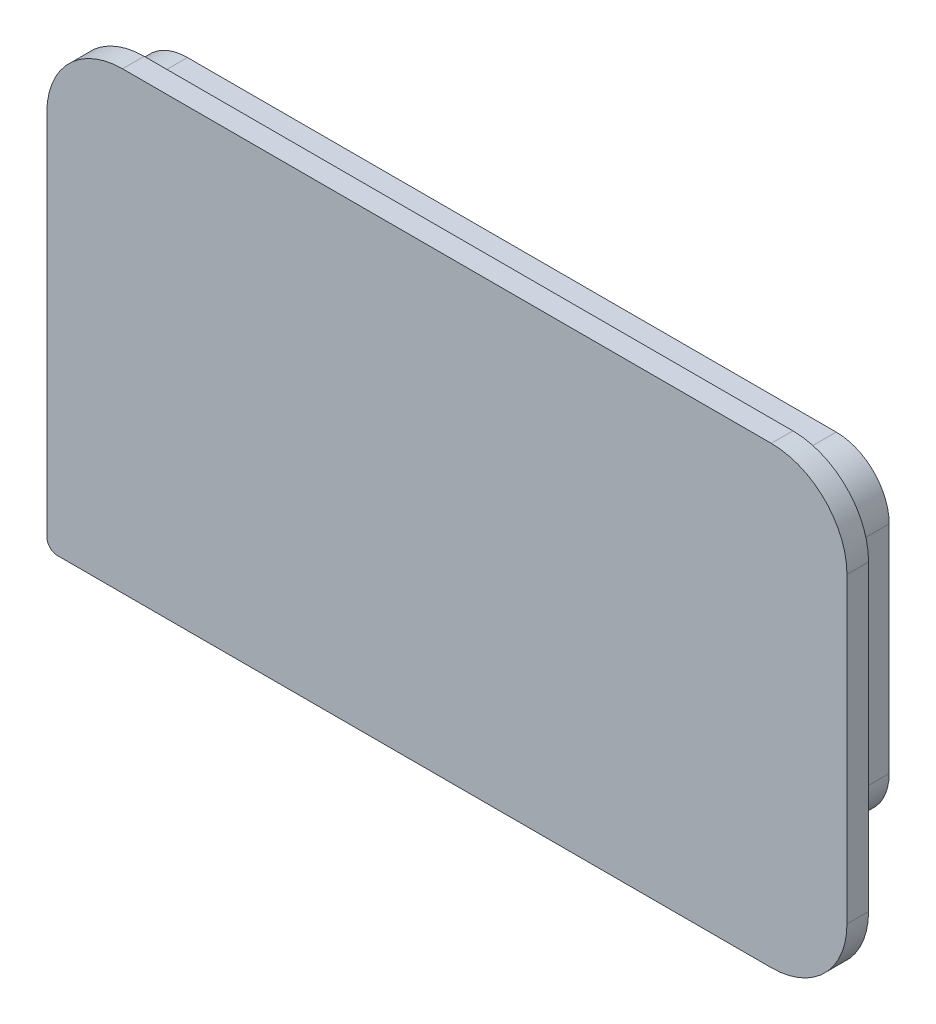
ISO-10303-21;
HEADER;
FILE_DESCRIPTION(('STEP AP214'),'2;1');
FILE_NAME('part.step','',(''),(''),'','','');
FILE_SCHEMA(('AUTOMOTIVE_DESIGN { 1 0 10303 214 1 1 1 1 }'));
ENDSEC;
DATA;
#1=APPLICATION_CONTEXT('core data for automotive mechanical design processes');
#2=APPLICATION_PROTOCOL_DEFINITION('international standard','automotive_design',2000,#1);
#3=PRODUCT_CONTEXT('',#1,'mechanical');
#4=PRODUCT('Part','Part','',(#3));
#5=PRODUCT_RELATED_PRODUCT_CATEGORY('part','',(#4));
#6=PRODUCT_DEFINITION_FORMATION('','',#4);
#7=PRODUCT_DEFINITION_CONTEXT('part definition',#1,'design');
#8=PRODUCT_DEFINITION('design','',#6,#7);
#9=PRODUCT_DEFINITION_SHAPE('','',#8);
#10=(LENGTH_UNIT() NAMED_UNIT(*) SI_UNIT(.MILLI.,.METRE.));
#11=(NAMED_UNIT(*) PLANE_ANGLE_UNIT() SI_UNIT($,.RADIAN.));
#12=(NAMED_UNIT(*) SI_UNIT($,.STERADIAN.) SOLID_ANGLE_UNIT());
#13=UNCERTAINTY_MEASURE_WITH_UNIT(LENGTH_MEASURE(1.E-05),#10,'distance_accuracy_value','');
#14=(GEOMETRIC_REPRESENTATION_CONTEXT(3) GLOBAL_UNCERTAINTY_ASSIGNED_CONTEXT((#13)) GLOBAL_UNIT_ASSIGNED_CONTEXT((#10,
#11,#12)) REPRESENTATION_CONTEXT('',''));
#15=CARTESIAN_POINT('',(0.,0.,0.));
#16=DIRECTION('',(0.,0.,1.));
#17=DIRECTION('',(1.,0.,0.));
#18=AXIS2_PLACEMENT_3D('',#15,#16,#17);
#19=CARTESIAN_POINT('',(-37.,-21.,2.));
#20=DIRECTION('',(1.,0.,0.));
#21=DIRECTION('',(0.,0.,-1.));
#22=AXIS2_PLACEMENT_3D('',#19,#20,#21);
#23=PLANE('',#22);
#24=DIRECTION('',(0.,1.,0.));
#25=VECTOR('',#24,1.);
#26=CARTESIAN_POINT('',(-37.,-21.,0.));
#27=LINE('',#26,#25);
#28=CARTESIAN_POINT('',(-37.,-20.,0.));
#29=VERTEX_POINT('',#28);
#30=CARTESIAN_POINT('',(-37.,14.,0.));
#31=VERTEX_POINT('',#30);
#32=EDGE_CURVE('E277',#29,#31,#27,.T.);
#33=ORIENTED_EDGE('',*,*,#32,.F.);
#34=DIRECTION('',(0.,0.,-1.));
#35=VECTOR('',#34,1.);
#36=CARTESIAN_POINT('',(-37.,-20.,2.));
#37=LINE('',#36,#35);
#38=CARTESIAN_POINT('',(-37.,-20.,2.));
#39=VERTEX_POINT('',#38);
#40=EDGE_CURVE('E43',#29,#39,#37,.F.);
#41=ORIENTED_EDGE('',*,*,#40,.T.);
#42=DIRECTION('',(0.,-1.,0.));
#43=VECTOR('',#42,1.);
#44=CARTESIAN_POINT('',(-37.,-21.,2.));
#45=LINE('',#44,#43);
#46=CARTESIAN_POINT('',(-37.,14.,2.));
#47=VERTEX_POINT('',#46);
#48=EDGE_CURVE('E313',#47,#39,#45,.T.);
#49=ORIENTED_EDGE('',*,*,#48,.F.);
#50=DIRECTION('',(0.,0.,-1.));
#51=VECTOR('',#50,1.);
#52=CARTESIAN_POINT('',(-37.,14.,2.));
#53=LINE('',#52,#51);
#54=EDGE_CURVE('E383',#47,#31,#53,.T.);
#55=ORIENTED_EDGE('',*,*,#54,.T.);
#56=EDGE_LOOP('',(#33,#41,#49,#55));
#57=FACE_BOUND('',#56,.T.);
#58=ADVANCED_FACE('F35',(#57),#23,.F.);
#59=CARTESIAN_POINT('',(37.,-21.,2.));
#60=DIRECTION('',(0.,1.,0.));
#61=DIRECTION('',(-1.,0.,0.));
#62=AXIS2_PLACEMENT_3D('',#59,#60,#61);
#63=PLANE('',#62);
#64=DIRECTION('',(1.,0.,0.));
#65=VECTOR('',#64,1.);
#66=CARTESIAN_POINT('',(37.,-21.,2.));
#67=LINE('',#66,#65);
#68=CARTESIAN_POINT('',(-36.,-21.,2.));
#69=VERTEX_POINT('',#68);
#70=CARTESIAN_POINT('',(30.,-21.,2.));
#71=VERTEX_POINT('',#70);
#72=EDGE_CURVE('E315',#69,#71,#67,.T.);
#73=ORIENTED_EDGE('',*,*,#72,.F.);
#74=DIRECTION('',(0.,0.,-1.));
#75=VECTOR('',#74,1.);
#76=CARTESIAN_POINT('',(-36.,-21.,2.));
#77=LINE('',#76,#75);
#78=CARTESIAN_POINT('',(-36.,-21.,0.));
#79=VERTEX_POINT('',#78);
#80=EDGE_CURVE('E446',#69,#79,#77,.T.);
#81=ORIENTED_EDGE('',*,*,#80,.T.);
#82=DIRECTION('',(-1.,0.,0.));
#83=VECTOR('',#82,1.);
#84=CARTESIAN_POINT('',(37.,-21.,0.));
#85=LINE('',#84,#83);
#86=CARTESIAN_POINT('',(-35.5417424305044,-21.,0.));
#87=VERTEX_POINT('',#86);
#88=EDGE_CURVE('E284',#87,#79,#85,.T.);
#89=ORIENTED_EDGE('',*,*,#88,.F.);
#90=DIRECTION('',(0.,0.,1.));
#91=VECTOR('',#90,1.);
#92=CARTESIAN_POINT('',(-35.5417424305044,-21.,-90.3608809701494));
#93=LINE('',#92,#91);
#94=CARTESIAN_POINT('',(-35.5417424305044,-21.,-5.));
#95=VERTEX_POINT('',#94);
#96=EDGE_CURVE('E227',#95,#87,#93,.T.);
#97=ORIENTED_EDGE('',*,*,#96,.F.);
#98=DIRECTION('',(-1.,0.,0.));
#99=VECTOR('',#98,1.);
#100=CARTESIAN_POINT('',(-35.,-21.,-5.));
#101=LINE('',#100,#99);
#102=CARTESIAN_POINT('',(-35.,-21.,-5.));
#103=VERTEX_POINT('',#102);
#104=EDGE_CURVE('E309',#103,#95,#101,.T.);
#105=ORIENTED_EDGE('',*,*,#104,.F.);
#106=CARTESIAN_POINT('',(-30.,-21.,-5.));
#107=DIRECTION('',(0.,1.,0.));
#108=DIRECTION('',(-1.,0.,0.));
#109=AXIS2_PLACEMENT_3D('',#106,#107,#108);
#110=CIRCLE('',#109,5.);
#111=CARTESIAN_POINT('',(-30.,-21.,0.));
#112=VERTEX_POINT('',#111);
#113=EDGE_CURVE('E340',#103,#112,#110,.T.);
#114=ORIENTED_EDGE('',*,*,#113,.T.);
#115=DIRECTION('',(1.,0.,0.));
#116=VECTOR('',#115,1.);
#117=CARTESIAN_POINT('',(37.,-21.,0.));
#118=LINE('',#117,#116);
#119=CARTESIAN_POINT('',(0.,-21.,0.));
#120=VERTEX_POINT('',#119);
#121=EDGE_CURVE('E312',#112,#120,#118,.T.);
#122=ORIENTED_EDGE('',*,*,#121,.T.);
#123=CARTESIAN_POINT('',(0.,-21.,-5.));
#124=DIRECTION('',(0.,1.,0.));
#125=DIRECTION('',(-1.,0.,0.));
#126=AXIS2_PLACEMENT_3D('',#123,#124,#125);
#127=CIRCLE('',#126,5.);
#128=CARTESIAN_POINT('',(5.00000000000002,-21.,-5.));
#129=VERTEX_POINT('',#128);
#130=EDGE_CURVE('E337',#120,#129,#127,.T.);
#131=ORIENTED_EDGE('',*,*,#130,.T.);
#132=DIRECTION('',(-1.,0.,0.));
#133=VECTOR('',#132,1.);
#134=CARTESIAN_POINT('',(37.,-21.,-5.));
#135=LINE('',#134,#133);
#136=CARTESIAN_POINT('',(5.54174243050443,-21.,-5.));
#137=VERTEX_POINT('',#136);
#138=EDGE_CURVE('E301',#137,#129,#135,.T.);
#139=ORIENTED_EDGE('',*,*,#138,.F.);
#140=DIRECTION('',(0.,0.,1.));
#141=VECTOR('',#140,1.);
#142=CARTESIAN_POINT('',(5.5417424305044,-21.,-90.3608809701494));
#143=LINE('',#142,#141);
#144=CARTESIAN_POINT('',(5.54174243050439,-21.,0.));
#145=VERTEX_POINT('',#144);
#146=EDGE_CURVE('E290',#145,#137,#143,.F.);
#147=ORIENTED_EDGE('',*,*,#146,.F.);
#148=CARTESIAN_POINT('',(30.,-21.,0.));
#149=VERTEX_POINT('',#148);
#150=EDGE_CURVE('E287',#149,#145,#85,.T.);
#151=ORIENTED_EDGE('',*,*,#150,.F.);
#152=DIRECTION('',(0.,0.,-1.));
#153=VECTOR('',#152,1.);
#154=CARTESIAN_POINT('',(30.,-21.,2.));
#155=LINE('',#154,#153);
#156=EDGE_CURVE('E369',#149,#71,#155,.F.);
#157=ORIENTED_EDGE('',*,*,#156,.T.);
#158=EDGE_LOOP('',(#73,#81,#89,#97,#105,#114,#122,#131,#139,#147,#151,#157));
#159=FACE_BOUND('',#158,.T.);
#160=ADVANCED_FACE('F434',(#159),#63,.F.);
#161=CARTESIAN_POINT('',(37.,-21.,2.));
#162=DIRECTION('',(-1.,0.,0.));
#163=DIRECTION('',(0.,0.,1.));
#164=AXIS2_PLACEMENT_3D('',#161,#162,#163);
#165=PLANE('',#164);
#166=DIRECTION('',(0.,-1.,0.));
#167=VECTOR('',#166,1.);
#168=CARTESIAN_POINT('',(37.,-21.,0.));
#169=LINE('',#168,#167);
#170=CARTESIAN_POINT('',(37.,14.,0.));
#171=VERTEX_POINT('',#170);
#172=CARTESIAN_POINT('',(37.,-14.,0.));
#173=VERTEX_POINT('',#172);
#174=EDGE_CURVE('E282',#171,#173,#169,.T.);
#175=ORIENTED_EDGE('',*,*,#174,.F.);
#176=DIRECTION('',(0.,0.,-1.));
#177=VECTOR('',#176,1.);
#178=CARTESIAN_POINT('',(37.,14.,2.));
#179=LINE('',#178,#177);
#180=CARTESIAN_POINT('',(37.,14.,2.));
#181=VERTEX_POINT('',#180);
#182=EDGE_CURVE('E342',#171,#181,#179,.F.);
#183=ORIENTED_EDGE('',*,*,#182,.T.);
#184=DIRECTION('',(0.,1.,0.));
#185=VECTOR('',#184,1.);
#186=CARTESIAN_POINT('',(37.,-21.,2.));
#187=LINE('',#186,#185);
#188=CARTESIAN_POINT('',(37.,-14.,2.));
#189=VERTEX_POINT('',#188);
#190=EDGE_CURVE('E317',#189,#181,#187,.T.);
#191=ORIENTED_EDGE('',*,*,#190,.F.);
#192=DIRECTION('',(0.,0.,-1.));
#193=VECTOR('',#192,1.);
#194=CARTESIAN_POINT('',(37.,-14.,2.));
#195=LINE('',#194,#193);
#196=EDGE_CURVE('E366',#189,#173,#195,.T.);
#197=ORIENTED_EDGE('',*,*,#196,.T.);
#198=EDGE_LOOP('',(#175,#183,#191,#197));
#199=FACE_BOUND('',#198,.T.);
#200=ADVANCED_FACE('F430',(#199),#165,.F.);
#201=CARTESIAN_POINT('',(37.,21.,2.));
#202=DIRECTION('',(0.,-1.,0.));
#203=DIRECTION('',(1.,0.,0.));
#204=AXIS2_PLACEMENT_3D('',#201,#202,#203);
#205=PLANE('',#204);
#206=DIRECTION('',(1.,0.,0.));
#207=VECTOR('',#206,1.);
#208=CARTESIAN_POINT('',(37.,21.,0.));
#209=LINE('',#208,#207);
#210=CARTESIAN_POINT('',(-30.,21.,0.));
#211=VERTEX_POINT('',#210);
#212=CARTESIAN_POINT('',(30.,21.,0.));
#213=VERTEX_POINT('',#212);
#214=EDGE_CURVE('E265',#211,#213,#209,.T.);
#215=ORIENTED_EDGE('',*,*,#214,.F.);
#216=DIRECTION('',(0.,0.,-1.));
#217=VECTOR('',#216,1.);
#218=CARTESIAN_POINT('',(-30.,21.,2.));
#219=LINE('',#218,#217);
#220=CARTESIAN_POINT('',(-30.,21.,2.));
#221=VERTEX_POINT('',#220);
#222=EDGE_CURVE('E378',#211,#221,#219,.F.);
#223=ORIENTED_EDGE('',*,*,#222,.T.);
#224=DIRECTION('',(-1.,0.,0.));
#225=VECTOR('',#224,1.);
#226=CARTESIAN_POINT('',(37.,21.,2.));
#227=LINE('',#226,#225);
#228=CARTESIAN_POINT('',(30.,21.,2.));
#229=VERTEX_POINT('',#228);
#230=EDGE_CURVE('E320',#229,#221,#227,.T.);
#231=ORIENTED_EDGE('',*,*,#230,.F.);
#232=DIRECTION('',(0.,0.,-1.));
#233=VECTOR('',#232,1.);
#234=CARTESIAN_POINT('',(30.,21.,2.));
#235=LINE('',#234,#233);
#236=EDGE_CURVE('E380',#229,#213,#235,.T.);
#237=ORIENTED_EDGE('',*,*,#236,.T.);
#238=EDGE_LOOP('',(#215,#223,#231,#237));
#239=FACE_BOUND('',#238,.T.);
#240=ADVANCED_FACE('F427',(#239),#205,.F.);
#241=CARTESIAN_POINT('',(0.,0.,-5.));
#242=DIRECTION('',(0.,0.,-1.));
#243=DIRECTION('',(-1.,0.,0.));
#244=AXIS2_PLACEMENT_3D('',#241,#242,#243);
#245=PLANE('',#244);
#246=DIRECTION('',(0.,1.,0.));
#247=VECTOR('',#246,1.);
#248=CARTESIAN_POINT('',(5.00000000000002,-21.,-5.));
#249=LINE('',#248,#247);
#250=CARTESIAN_POINT('',(5.00000000000002,-20.4582575694956,-5.));
#251=VERTEX_POINT('',#250);
#252=EDGE_CURVE('E303',#129,#251,#249,.T.);
#253=ORIENTED_EDGE('',*,*,#252,.T.);
#254=CARTESIAN_POINT('',(6.00000000000003,-20.,-5.));
#255=DIRECTION('',(0.,0.,-1.));
#256=DIRECTION('',(-1.,0.,0.));
#257=AXIS2_PLACEMENT_3D('',#254,#255,#256);
#258=CIRCLE('',#257,1.10000000000001);
#259=EDGE_CURVE('E228',#137,#251,#258,.T.);
#260=ORIENTED_EDGE('',*,*,#259,.F.);
#261=ORIENTED_EDGE('',*,*,#138,.T.);
#262=EDGE_LOOP('',(#253,#260,#261));
#263=FACE_BOUND('',#262,.T.);
#264=ADVANCED_FACE('F418',(#263),#245,.T.);
#265=CARTESIAN_POINT('',(-30.,19.,-5.));
#266=DIRECTION('',(0.,1.,0.));
#267=DIRECTION('',(-1.,0.,0.));
#268=AXIS2_PLACEMENT_3D('',#265,#266,#267);
#269=CYLINDRICAL_SURFACE('',#268,5.);
#270=DIRECTION('',(0.,1.,0.));
#271=VECTOR('',#270,1.);
#272=CARTESIAN_POINT('',(-34.9,19.,-4.00501256289337));
#273=LINE('',#272,#271);
#274=CARTESIAN_POINT('',(-34.9,14.,-4.00501256289339));
#275=VERTEX_POINT('',#274);
#276=CARTESIAN_POINT('',(-34.9,-20.,-4.00501256289341));
#277=VERTEX_POINT('',#276);
#278=EDGE_CURVE('E210',#275,#277,#273,.F.);
#279=ORIENTED_EDGE('',*,*,#278,.F.);
#280=CARTESIAN_POINT('',(-30.,14.,-5.));
#281=DIRECTION('',(0.,-1.,0.));
#282=DIRECTION('',(1.,0.,0.));
#283=AXIS2_PLACEMENT_3D('',#280,#281,#282);
#284=CIRCLE('',#283,5.);
#285=CARTESIAN_POINT('',(-30.,14.,0.));
#286=VERTEX_POINT('',#285);
#287=EDGE_CURVE('E304',#286,#275,#284,.T.);
#288=ORIENTED_EDGE('',*,*,#287,.F.);
#289=DIRECTION('',(0.,-1.,0.));
#290=VECTOR('',#289,1.);
#291=CARTESIAN_POINT('',(-30.,14.,0.));
#292=LINE('',#291,#290);
#293=EDGE_CURVE('E327',#112,#286,#292,.F.);
#294=ORIENTED_EDGE('',*,*,#293,.F.);
#295=ORIENTED_EDGE('',*,*,#113,.F.);
#296=DIRECTION('',(0.,-1.,0.));
#297=VECTOR('',#296,1.);
#298=CARTESIAN_POINT('',(-35.,19.,-5.));
#299=LINE('',#298,#297);
#300=CARTESIAN_POINT('',(-35.,-20.4582575694956,-5.));
#301=VERTEX_POINT('',#300);
#302=EDGE_CURVE('E307',#301,#103,#299,.T.);
#303=ORIENTED_EDGE('',*,*,#302,.F.);
#304=CARTESIAN_POINT('',(-34.9,-20.,-4.00501256289341));
#305=CARTESIAN_POINT('',(-34.8999915983994,-20.0134955546732,-4.00497881303423));
#306=CARTESIAN_POINT('',(-34.9002480471387,-20.0269465258921,-4.00623380763816));
#307=CARTESIAN_POINT('',(-34.9012151153828,-20.0532775697589,-4.01101057698273));
#308=CARTESIAN_POINT('',(-34.9019207456639,-20.0661622720958,-4.01450745332881));
#309=CARTESIAN_POINT('',(-34.9039108823675,-20.0939427268731,-4.02445548501889));
#310=CARTESIAN_POINT('',(-34.9052886227614,-20.1086568307123,-4.0313875108155));
#311=CARTESIAN_POINT('',(-34.9084455253942,-20.1367848838335,-4.04751330040455));
#312=CARTESIAN_POINT('',(-34.9102264352954,-20.1501927978916,-4.0567169273138));
#313=CARTESIAN_POINT('',(-34.9150838411459,-20.1826374999891,-4.08228688084141));
#314=CARTESIAN_POINT('',(-34.9183350310132,-20.2007259341808,-4.09981237313399));
#315=CARTESIAN_POINT('',(-34.9250530367948,-20.2340440865041,-4.13731741922263));
#316=CARTESIAN_POINT('',(-34.9285202482704,-20.2492683422078,-4.15730154438346));
#317=CARTESIAN_POINT('',(-34.9384538903888,-20.2895908772908,-4.21692434060829));
#318=CARTESIAN_POINT('',(-34.9449045231274,-20.31175201217,-4.25853256419205));
#319=CARTESIAN_POINT('',(-34.957054252369,-20.3502320456013,-4.34460925690084));
#320=CARTESIAN_POINT('',(-34.9627482911278,-20.3665127658836,-4.38909428179906));
#321=CARTESIAN_POINT('',(-34.9731487201794,-20.3947223463197,-4.48044067215257));
#322=CARTESIAN_POINT('',(-34.9778345681945,-20.4065637942785,-4.52733096771512));
#323=CARTESIAN_POINT('',(-34.9859252642906,-20.4263383448012,-4.62208686700673));
#324=CARTESIAN_POINT('',(-34.9893281355925,-20.434265421971,-4.66995385696675));
#325=CARTESIAN_POINT('',(-34.994685657637,-20.4465294116886,-4.76482883610668));
#326=CARTESIAN_POINT('',(-34.9966787216314,-20.4509619623261,-4.81182257118118));
#327=CARTESIAN_POINT('',(-34.9993359551541,-20.4568061190959,-4.90588232153309));
#328=CARTESIAN_POINT('',(-35.0000044607306,-20.4582275833206,-4.9529475945252));
#329=CARTESIAN_POINT('',(-35.,-20.4582575694956,-5.));
#330=B_SPLINE_CURVE_WITH_KNOTS('',3,(#304,#305,#306,#307,#308,#309,#310,#311,#312,#313,#314,
#315,#316,#317,#318,#319,#320,#321,#322,#323,#324,#325,#326,#327,#328,#329),.UNSPECIFIED.,.F.,
.F.,(4,2,2,2,2,2,2,2,2,2,2,2,4),(0.,0.0403539634451231,0.0802673407297359,0.128966678011095,
0.177881303139235,0.25363631803589,0.329534376389645,0.471483409242871,0.614338140573204,
0.759874021275463,0.905633232512592,1.04724958241801,1.1884015688318),.UNSPECIFIED.);
#331=EDGE_CURVE('E450',#277,#301,#330,.T.);
#332=ORIENTED_EDGE('',*,*,#331,.F.);
#333=EDGE_LOOP('',(#279,#288,#294,#295,#303,#332));
#334=FACE_BOUND('',#333,.T.);
#335=ADVANCED_FACE('F459',(#334),#269,.F.);
#336=CARTESIAN_POINT('',(-30.,14.,-5.));
#337=DIRECTION('',(0.,0.,1.));
#338=DIRECTION('',(1.,0.,0.));
#339=AXIS2_PLACEMENT_3D('',#336,#337,#338);
#340=SPHERICAL_SURFACE('',#339,5.);
#341=CARTESIAN_POINT('',(-30.,14.,-4.00501256289337));
#342=DIRECTION('',(0.,0.,-1.));
#343=DIRECTION('',(-1.,0.,0.));
#344=AXIS2_PLACEMENT_3D('',#341,#342,#343);
#345=CIRCLE('',#344,4.9);
#346=CARTESIAN_POINT('',(-30.,18.9,-4.00501256289339));
#347=VERTEX_POINT('',#346);
#348=EDGE_CURVE('E457',#347,#275,#345,.F.);
#349=ORIENTED_EDGE('',*,*,#348,.F.);
#350=CARTESIAN_POINT('',(-30.,14.,-5.));
#351=DIRECTION('',(-1.,0.,0.));
#352=DIRECTION('',(0.,0.,1.));
#353=AXIS2_PLACEMENT_3D('',#350,#351,#352);
#354=CIRCLE('',#353,5.);
#355=EDGE_CURVE('E360',#286,#347,#354,.T.);
#356=ORIENTED_EDGE('',*,*,#355,.F.);
#357=ORIENTED_EDGE('',*,*,#287,.T.);
#358=EDGE_LOOP('',(#349,#356,#357));
#359=FACE_BOUND('',#358,.T.);
#360=ADVANCED_FACE('F533',(#359),#340,.F.);
#361=CARTESIAN_POINT('',(35.,14.,-5.));
#362=DIRECTION('',(1.,0.,0.));
#363=DIRECTION('',(0.,1.,0.));
#364=AXIS2_PLACEMENT_3D('',#361,#362,#363);
#365=CYLINDRICAL_SURFACE('',#364,5.);
#366=DIRECTION('',(1.,0.,0.));
#367=VECTOR('',#366,1.);
#368=CARTESIAN_POINT('',(35.,18.9,-4.00501256289339));
#369=LINE('',#368,#367);
#370=CARTESIAN_POINT('',(30.,18.9,-4.00501256289339));
#371=VERTEX_POINT('',#370);
#372=EDGE_CURVE('E296',#371,#347,#369,.F.);
#373=ORIENTED_EDGE('',*,*,#372,.F.);
#374=CARTESIAN_POINT('',(30.,14.,-5.));
#375=DIRECTION('',(-1.,0.,0.));
#376=DIRECTION('',(0.,0.,1.));
#377=AXIS2_PLACEMENT_3D('',#374,#375,#376);
#378=CIRCLE('',#377,5.);
#379=CARTESIAN_POINT('',(30.,14.,0.));
#380=VERTEX_POINT('',#379);
#381=EDGE_CURVE('E357',#380,#371,#378,.T.);
#382=ORIENTED_EDGE('',*,*,#381,.F.);
#383=DIRECTION('',(-1.,0.,0.));
#384=VECTOR('',#383,1.);
#385=CARTESIAN_POINT('',(30.,14.,0.));
#386=LINE('',#385,#384);
#387=EDGE_CURVE('E323',#286,#380,#386,.F.);
#388=ORIENTED_EDGE('',*,*,#387,.F.);
#389=ORIENTED_EDGE('',*,*,#355,.T.);
#390=EDGE_LOOP('',(#373,#382,#388,#389));
#391=FACE_BOUND('',#390,.T.);
#392=ADVANCED_FACE('F537',(#391),#365,.F.);
#393=CARTESIAN_POINT('',(30.,14.,-5.));
#394=DIRECTION('',(0.,0.,1.));
#395=DIRECTION('',(1.,0.,0.));
#396=AXIS2_PLACEMENT_3D('',#393,#394,#395);
#397=SPHERICAL_SURFACE('',#396,5.);
#398=CARTESIAN_POINT('',(30.,14.,-4.00501256289338));
#399=DIRECTION('',(0.,0.,-1.));
#400=DIRECTION('',(-1.,0.,0.));
#401=AXIS2_PLACEMENT_3D('',#398,#399,#400);
#402=CIRCLE('',#401,4.9);
#403=CARTESIAN_POINT('',(34.9,13.9999999999999,-4.00501256289337));
#404=VERTEX_POINT('',#403);
#405=EDGE_CURVE('E548',#404,#371,#402,.F.);
#406=ORIENTED_EDGE('',*,*,#405,.F.);
#407=CARTESIAN_POINT('',(30.,14.,-5.));
#408=DIRECTION('',(0.,1.,0.));
#409=DIRECTION('',(0.,0.,1.));
#410=AXIS2_PLACEMENT_3D('',#407,#408,#409);
#411=CIRCLE('',#410,5.);
#412=EDGE_CURVE('E354',#380,#404,#411,.T.);
#413=ORIENTED_EDGE('',*,*,#412,.F.);
#414=ORIENTED_EDGE('',*,*,#381,.T.);
#415=EDGE_LOOP('',(#406,#413,#414));
#416=FACE_BOUND('',#415,.T.);
#417=ADVANCED_FACE('F557',(#416),#397,.F.);
#418=CARTESIAN_POINT('',(30.,-11.,-5.));
#419=DIRECTION('',(0.,-1.,0.));
#420=DIRECTION('',(0.,0.,-1.));
#421=AXIS2_PLACEMENT_3D('',#418,#419,#420);
#422=CYLINDRICAL_SURFACE('',#421,5.);
#423=DIRECTION('',(0.,-1.,0.));
#424=VECTOR('',#423,1.);
#425=CARTESIAN_POINT('',(34.9,-11.,-4.00501256289337));
#426=LINE('',#425,#424);
#427=CARTESIAN_POINT('',(34.9,-6.00000000000002,-4.00501256289337));
#428=VERTEX_POINT('',#427);
#429=EDGE_CURVE('E294',#428,#404,#426,.F.);
#430=ORIENTED_EDGE('',*,*,#429,.F.);
#431=CARTESIAN_POINT('',(30.,-6.00000000000002,-5.));
#432=DIRECTION('',(0.,1.,0.));
#433=DIRECTION('',(0.,0.,1.));
#434=AXIS2_PLACEMENT_3D('',#431,#432,#433);
#435=CIRCLE('',#434,5.);
#436=CARTESIAN_POINT('',(30.,-6.00000000000002,0.));
#437=VERTEX_POINT('',#436);
#438=EDGE_CURVE('E351',#437,#428,#435,.T.);
#439=ORIENTED_EDGE('',*,*,#438,.F.);
#440=DIRECTION('',(0.,1.,0.));
#441=VECTOR('',#440,1.);
#442=CARTESIAN_POINT('',(30.,-6.00000000000002,0.));
#443=LINE('',#442,#441);
#444=EDGE_CURVE('E329',#380,#437,#443,.F.);
#445=ORIENTED_EDGE('',*,*,#444,.F.);
#446=ORIENTED_EDGE('',*,*,#412,.T.);
#447=EDGE_LOOP('',(#430,#439,#445,#446));
#448=FACE_BOUND('',#447,.T.);
#449=ADVANCED_FACE('F543',(#448),#422,.F.);
#450=CARTESIAN_POINT('',(30.,-6.00000000000002,-5.));
#451=DIRECTION('',(0.,0.,1.));
#452=DIRECTION('',(1.,0.,0.));
#453=AXIS2_PLACEMENT_3D('',#450,#451,#452);
#454=SPHERICAL_SURFACE('',#453,5.);
#455=CARTESIAN_POINT('',(30.,-6.00000000000002,-4.00501256289338));
#456=DIRECTION('',(0.,0.,-1.));
#457=DIRECTION('',(-1.,0.,0.));
#458=AXIS2_PLACEMENT_3D('',#455,#456,#457);
#459=CIRCLE('',#458,4.9);
#460=CARTESIAN_POINT('',(30.,-10.9,-4.00501256289339));
#461=VERTEX_POINT('',#460);
#462=EDGE_CURVE('E502',#461,#428,#459,.F.);
#463=ORIENTED_EDGE('',*,*,#462,.F.);
#464=CARTESIAN_POINT('',(30.,-6.00000000000002,-5.));
#465=DIRECTION('',(1.,0.,0.));
#466=DIRECTION('',(0.,0.,-1.));
#467=AXIS2_PLACEMENT_3D('',#464,#465,#466);
#468=CIRCLE('',#467,5.);
#469=EDGE_CURVE('E348',#437,#461,#468,.T.);
#470=ORIENTED_EDGE('',*,*,#469,.F.);
#471=ORIENTED_EDGE('',*,*,#438,.T.);
#472=EDGE_LOOP('',(#463,#470,#471));
#473=FACE_BOUND('',#472,.T.);
#474=ADVANCED_FACE('F546',(#473),#454,.F.);
#475=CARTESIAN_POINT('',(5.00000000000002,-6.00000000000002,-5.));
#476=DIRECTION('',(-1.,0.,0.));
#477=DIRECTION('',(0.,0.,1.));
#478=AXIS2_PLACEMENT_3D('',#475,#476,#477);
#479=CYLINDRICAL_SURFACE('',#478,5.);
#480=DIRECTION('',(-1.,0.,0.));
#481=VECTOR('',#480,1.);
#482=CARTESIAN_POINT('',(5.00000000000002,-10.9,-4.00501256289338));
#483=LINE('',#482,#481);
#484=CARTESIAN_POINT('',(10.0000000000001,-10.9,-4.00501256289337));
#485=VERTEX_POINT('',#484);
#486=EDGE_CURVE('E292',#485,#461,#483,.F.);
#487=ORIENTED_EDGE('',*,*,#486,.F.);
#488=CARTESIAN_POINT('',(10.,-6.00000000000002,-5.));
#489=DIRECTION('',(1.,0.,0.));
#490=DIRECTION('',(0.,0.,-1.));
#491=AXIS2_PLACEMENT_3D('',#488,#489,#490);
#492=CIRCLE('',#491,5.);
#493=CARTESIAN_POINT('',(10.,-6.00000000000002,0.));
#494=VERTEX_POINT('',#493);
#495=EDGE_CURVE('E345',#494,#485,#492,.T.);
#496=ORIENTED_EDGE('',*,*,#495,.F.);
#497=DIRECTION('',(1.,0.,0.));
#498=VECTOR('',#497,1.);
#499=CARTESIAN_POINT('',(10.,-6.00000000000002,0.));
#500=LINE('',#499,#498);
#501=EDGE_CURVE('E331',#437,#494,#500,.F.);
#502=ORIENTED_EDGE('',*,*,#501,.F.);
#503=ORIENTED_EDGE('',*,*,#469,.T.);
#504=EDGE_LOOP('',(#487,#496,#502,#503));
#505=FACE_BOUND('',#504,.T.);
#506=ADVANCED_FACE('F508',(#505),#479,.F.);
#507=CARTESIAN_POINT('',(10.,-16.,-5.));
#508=DIRECTION('',(0.,0.,1.));
#509=DIRECTION('',(1.,0.,0.));
#510=AXIS2_PLACEMENT_3D('',#507,#508,#509);
#511=TOROIDAL_SURFACE('',#510,10.,5.);
#512=CARTESIAN_POINT('',(10.,-16.,-4.00501256289338));
#513=DIRECTION('',(0.,0.,-1.));
#514=DIRECTION('',(-1.,0.,0.));
#515=AXIS2_PLACEMENT_3D('',#512,#513,#514);
#516=CIRCLE('',#515,5.1);
#517=CARTESIAN_POINT('',(4.90000000000003,-16.0000000000001,-4.00501256289337));
#518=VERTEX_POINT('',#517);
#519=EDGE_CURVE('E398',#518,#485,#516,.T.);
#520=ORIENTED_EDGE('',*,*,#519,.F.);
#521=CARTESIAN_POINT('',(0.,-16.,-5.));
#522=DIRECTION('',(0.,1.,0.));
#523=DIRECTION('',(0.,0.,1.));
#524=AXIS2_PLACEMENT_3D('',#521,#522,#523);
#525=CIRCLE('',#524,5.);
#526=CARTESIAN_POINT('',(0.,-16.,0.));
#527=VERTEX_POINT('',#526);
#528=EDGE_CURVE('E300',#527,#518,#525,.T.);
#529=ORIENTED_EDGE('',*,*,#528,.F.);
#530=CARTESIAN_POINT('',(10.,-16.,0.));
#531=DIRECTION('',(0.,0.,1.));
#532=DIRECTION('',(1.,0.,0.));
#533=AXIS2_PLACEMENT_3D('',#530,#531,#532);
#534=CIRCLE('',#533,10.);
#535=EDGE_CURVE('E333',#494,#527,#534,.T.);
#536=ORIENTED_EDGE('',*,*,#535,.F.);
#537=ORIENTED_EDGE('',*,*,#495,.T.);
#538=EDGE_LOOP('',(#520,#529,#536,#537));
#539=FACE_BOUND('',#538,.T.);
#540=ADVANCED_FACE('F512',(#539),#511,.F.);
#541=CARTESIAN_POINT('',(0.,-21.,-5.));
#542=DIRECTION('',(0.,-1.,0.));
#543=DIRECTION('',(0.,0.,-1.));
#544=AXIS2_PLACEMENT_3D('',#541,#542,#543);
#545=CYLINDRICAL_SURFACE('',#544,5.);
#546=CARTESIAN_POINT('',(5.00000000000002,-20.4582575694956,-5.));
#547=CARTESIAN_POINT('',(5.00000431388343,-20.4582288912598,-4.9535351579081));
#548=CARTESIAN_POINT('',(4.99935245578674,-20.4568420642433,-4.9070571223246));
#549=CARTESIAN_POINT('',(4.9967614204984,-20.4511449726494,-4.8141825444765));
#550=CARTESIAN_POINT('',(4.99481849494306,-20.4468261949295,-4.76778663507484));
#551=CARTESIAN_POINT('',(4.98967948441771,-20.4350760790586,-4.67561646836858));
#552=CARTESIAN_POINT('',(4.98648772344836,-20.4276554747604,-4.62984062396873));
#553=CARTESIAN_POINT('',(4.97892342469302,-20.409272357736,-4.53914754425076));
#554=CARTESIAN_POINT('',(4.97455255379536,-20.3983148408197,-4.49422919197022));
#555=CARTESIAN_POINT('',(4.96637425897485,-20.3764366954059,-4.42032773930795));
#556=CARTESIAN_POINT('',(4.96285485749569,-20.3666908797749,-4.39096565127928));
#557=CARTESIAN_POINT('',(4.95540004386181,-20.3448829719737,-4.33301721880144));
#558=CARTESIAN_POINT('',(4.95146302090749,-20.3328117529281,-4.30443445511497));
#559=CARTESIAN_POINT('',(4.94225370515762,-20.3024722751679,-4.24146077995989));
#560=CARTESIAN_POINT('',(4.93689773101777,-20.2834086709682,-4.20745788094491));
#561=CARTESIAN_POINT('',(4.92617433541074,-20.2396008471144,-4.14335755120562));
#562=CARTESIAN_POINT('',(4.92080728179903,-20.2148990366921,-4.11323346558271));
#563=CARTESIAN_POINT('',(4.91396455499528,-20.1750933287785,-4.07637986600342));
#564=CARTESIAN_POINT('',(4.91207925175195,-20.1630686239275,-4.06642357463527));
#565=CARTESIAN_POINT('',(4.90858098812087,-20.1377273388438,-4.04820313264592));
#566=CARTESIAN_POINT('',(4.90696816034734,-20.1244101344855,-4.03993980557925));
#567=CARTESIAN_POINT('',(4.90413687616152,-20.0963586657728,-4.02557887049988));
#568=CARTESIAN_POINT('',(4.90292412514844,-20.0816074876825,-4.01951248269073));
#569=CARTESIAN_POINT('',(4.90108728210232,-20.0511860408196,-4.01037068873653));
#570=CARTESIAN_POINT('',(4.90046084952321,-20.0355196939494,-4.00728338871866));
#571=CARTESIAN_POINT('',(4.90011798504842,-20.0164501054282,-4.00559381517164));
#572=CARTESIAN_POINT('',(4.90007378365638,-20.0131633160384,-4.0053760140997));
#573=CARTESIAN_POINT('',(4.90001485195023,-20.0065848219679,-4.00508566385911));
#574=CARTESIAN_POINT('',(4.90000010585691,-20.0032931208647,-4.00501303692067));
#575=CARTESIAN_POINT('',(4.90000000000002,-20.,-4.00501256289326));
#576=B_SPLINE_CURVE_WITH_KNOTS('',3,(#546,#547,#548,#549,#550,#551,#552,#553,#554,#555,#556,
#557,#558,#559,#560,#561,#562,#563,#564,#565,#566,#567,#568,#569,#570,#571,#572,#573,#574,#575),
.UNSPECIFIED.,.F.,.F.,(4,2,2,2,2,2,2,2,2,2,2,2,2,2,4),(0.,0.139391189767112,0.279188853366787,
0.418506701300775,0.557628620735755,0.650962043246207,0.744669537618469,0.862384169912018,
0.979240970193081,1.02630373432827,1.07338933840355,1.12111999377291,1.16865928839887,
1.17854028164326,1.18841598021892),.UNSPECIFIED.);
#577=CARTESIAN_POINT('',(4.90000000000002,-20.,-4.00501256289337));
#578=VERTEX_POINT('',#577);
#579=EDGE_CURVE('E391',#251,#578,#576,.T.);
#580=ORIENTED_EDGE('',*,*,#579,.F.);
#581=ORIENTED_EDGE('',*,*,#252,.F.);
#582=ORIENTED_EDGE('',*,*,#130,.F.);
#583=DIRECTION('',(0.,1.,0.));
#584=VECTOR('',#583,1.);
#585=CARTESIAN_POINT('',(0.,-21.,0.));
#586=LINE('',#585,#584);
#587=EDGE_CURVE('E335',#527,#120,#586,.F.);
#588=ORIENTED_EDGE('',*,*,#587,.F.);
#589=ORIENTED_EDGE('',*,*,#528,.T.);
#590=DIRECTION('',(0.,-1.,0.));
#591=VECTOR('',#590,1.);
#592=CARTESIAN_POINT('',(4.90000000000003,-21.,-4.00501256289338));
#593=LINE('',#592,#591);
#594=EDGE_CURVE('E389',#578,#518,#593,.F.);
#595=ORIENTED_EDGE('',*,*,#594,.F.);
#596=EDGE_LOOP('',(#580,#581,#582,#588,#589,#595));
#597=FACE_BOUND('',#596,.T.);
#598=ADVANCED_FACE('F400',(#597),#545,.F.);
#599=CARTESIAN_POINT('',(30.,-14.,2.));
#600=DIRECTION('',(0.,0.,-1.));
#601=DIRECTION('',(-1.,0.,0.));
#602=AXIS2_PLACEMENT_3D('',#599,#600,#601);
#603=CYLINDRICAL_SURFACE('',#602,7.);
#604=ORIENTED_EDGE('',*,*,#156,.F.);
#605=CARTESIAN_POINT('',(30.,-14.,0.));
#606=DIRECTION('',(0.,0.,-1.));
#607=DIRECTION('',(-1.,0.,0.));
#608=AXIS2_PLACEMENT_3D('',#605,#606,#607);
#609=CIRCLE('',#608,7.);
#610=EDGE_CURVE('E286',#149,#173,#609,.F.);
#611=ORIENTED_EDGE('',*,*,#610,.T.);
#612=ORIENTED_EDGE('',*,*,#196,.F.);
#613=CARTESIAN_POINT('',(30.,-14.,2.));
#614=DIRECTION('',(0.,0.,1.));
#615=DIRECTION('',(1.,0.,0.));
#616=AXIS2_PLACEMENT_3D('',#613,#614,#615);
#617=CIRCLE('',#616,7.);
#618=EDGE_CURVE('E376',#71,#189,#617,.T.);
#619=ORIENTED_EDGE('',*,*,#618,.F.);
#620=EDGE_LOOP('',(#604,#611,#612,#619));
#621=FACE_BOUND('',#620,.T.);
#622=ADVANCED_FACE('F586',(#621),#603,.T.);
#623=CARTESIAN_POINT('',(30.,14.,2.));
#624=DIRECTION('',(0.,0.,-1.));
#625=DIRECTION('',(-1.,0.,0.));
#626=AXIS2_PLACEMENT_3D('',#623,#624,#625);
#627=CYLINDRICAL_SURFACE('',#626,7.);
#628=ORIENTED_EDGE('',*,*,#182,.F.);
#629=CARTESIAN_POINT('',(30.,14.,0.));
#630=DIRECTION('',(0.,0.,-1.));
#631=DIRECTION('',(-1.,0.,0.));
#632=AXIS2_PLACEMENT_3D('',#629,#630,#631);
#633=CIRCLE('',#632,7.);
#634=EDGE_CURVE('E279',#171,#213,#633,.F.);
#635=ORIENTED_EDGE('',*,*,#634,.T.);
#636=ORIENTED_EDGE('',*,*,#236,.F.);
#637=CARTESIAN_POINT('',(30.,14.,2.));
#638=DIRECTION('',(0.,0.,1.));
#639=DIRECTION('',(1.,0.,0.));
#640=AXIS2_PLACEMENT_3D('',#637,#638,#639);
#641=CIRCLE('',#640,7.);
#642=EDGE_CURVE('E374',#181,#229,#641,.T.);
#643=ORIENTED_EDGE('',*,*,#642,.F.);
#644=EDGE_LOOP('',(#628,#635,#636,#643));
#645=FACE_BOUND('',#644,.T.);
#646=ADVANCED_FACE('F593',(#645),#627,.T.);
#647=CARTESIAN_POINT('',(-30.,14.,2.));
#648=DIRECTION('',(0.,0.,-1.));
#649=DIRECTION('',(-1.,0.,0.));
#650=AXIS2_PLACEMENT_3D('',#647,#648,#649);
#651=CYLINDRICAL_SURFACE('',#650,7.);
#652=ORIENTED_EDGE('',*,*,#222,.F.);
#653=CARTESIAN_POINT('',(-30.,14.,0.));
#654=DIRECTION('',(0.,0.,-1.));
#655=DIRECTION('',(-1.,0.,0.));
#656=AXIS2_PLACEMENT_3D('',#653,#654,#655);
#657=CIRCLE('',#656,7.);
#658=EDGE_CURVE('E386',#211,#31,#657,.F.);
#659=ORIENTED_EDGE('',*,*,#658,.T.);
#660=ORIENTED_EDGE('',*,*,#54,.F.);
#661=CARTESIAN_POINT('',(-30.,14.,2.));
#662=DIRECTION('',(0.,0.,1.));
#663=DIRECTION('',(1.,0.,0.));
#664=AXIS2_PLACEMENT_3D('',#661,#662,#663);
#665=CIRCLE('',#664,7.);
#666=EDGE_CURVE('E372',#221,#47,#665,.T.);
#667=ORIENTED_EDGE('',*,*,#666,.F.);
#668=EDGE_LOOP('',(#652,#659,#660,#667));
#669=FACE_BOUND('',#668,.T.);
#670=ADVANCED_FACE('F425',(#669),#651,.T.);
#671=CARTESIAN_POINT('',(0.,0.,0.));
#672=DIRECTION('',(0.,0.,1.));
#673=DIRECTION('',(1.,0.,0.));
#674=AXIS2_PLACEMENT_3D('',#671,#672,#673);
#675=PLANE('',#674);
#676=ORIENTED_EDGE('',*,*,#535,.T.);
#677=ORIENTED_EDGE('',*,*,#587,.T.);
#678=ORIENTED_EDGE('',*,*,#121,.F.);
#679=ORIENTED_EDGE('',*,*,#293,.T.);
#680=ORIENTED_EDGE('',*,*,#387,.T.);
#681=ORIENTED_EDGE('',*,*,#444,.T.);
#682=ORIENTED_EDGE('',*,*,#501,.T.);
#683=EDGE_LOOP('',(#676,#677,#678,#679,#680,#681,#682));
#684=FACE_BOUND('',#683,.T.);
#685=ADVANCED_FACE('F421',(#684),#675,.F.);
#686=CARTESIAN_POINT('',(0.,0.,2.));
#687=DIRECTION('',(0.,0.,1.));
#688=DIRECTION('',(1.,0.,0.));
#689=AXIS2_PLACEMENT_3D('',#686,#687,#688);
#690=PLANE('',#689);
#691=ORIENTED_EDGE('',*,*,#48,.T.);
#692=CARTESIAN_POINT('',(-36.,-20.,2.));
#693=DIRECTION('',(0.,0.,1.));
#694=DIRECTION('',(1.,0.,0.));
#695=AXIS2_PLACEMENT_3D('',#692,#693,#694);
#696=CIRCLE('',#695,1.);
#697=EDGE_CURVE('E11',#39,#69,#696,.T.);
#698=ORIENTED_EDGE('',*,*,#697,.T.);
#699=ORIENTED_EDGE('',*,*,#72,.T.);
#700=ORIENTED_EDGE('',*,*,#618,.T.);
#701=ORIENTED_EDGE('',*,*,#190,.T.);
#702=ORIENTED_EDGE('',*,*,#642,.T.);
#703=ORIENTED_EDGE('',*,*,#230,.T.);
#704=ORIENTED_EDGE('',*,*,#666,.T.);
#705=EDGE_LOOP('',(#691,#698,#699,#700,#701,#702,#703,#704));
#706=FACE_BOUND('',#705,.T.);
#707=ADVANCED_FACE('F416',(#706),#690,.T.);
#708=ORIENTED_EDGE('',*,*,#104,.T.);
#709=CARTESIAN_POINT('',(-36.,-20.,-5.));
#710=DIRECTION('',(0.,0.,-1.));
#711=DIRECTION('',(-1.,0.,0.));
#712=AXIS2_PLACEMENT_3D('',#709,#710,#711);
#713=CIRCLE('',#712,1.09999999999999);
#714=EDGE_CURVE('E230',#301,#95,#713,.T.);
#715=ORIENTED_EDGE('',*,*,#714,.F.);
#716=ORIENTED_EDGE('',*,*,#302,.T.);
#717=EDGE_LOOP('',(#708,#715,#716));
#718=FACE_BOUND('',#717,.T.);
#719=ADVANCED_FACE('F413',(#718),#245,.T.);
#720=CARTESIAN_POINT('',(-36.,-20.,-90.3608809701494));
#721=DIRECTION('',(0.,0.,1.));
#722=DIRECTION('',(1.,0.,0.));
#723=AXIS2_PLACEMENT_3D('',#720,#721,#722);
#724=CYLINDRICAL_SURFACE('',#723,1.09999999999999);
#725=ORIENTED_EDGE('',*,*,#96,.T.);
#726=CARTESIAN_POINT('',(-36.,-20.,0.));
#727=DIRECTION('',(0.,0.,-1.));
#728=DIRECTION('',(-1.,0.,0.));
#729=AXIS2_PLACEMENT_3D('',#726,#727,#728);
#730=CIRCLE('',#729,1.09999999999999);
#731=CARTESIAN_POINT('',(-34.9,-20.,0.));
#732=VERTEX_POINT('',#731);
#733=EDGE_CURVE('E214',#732,#87,#730,.T.);
#734=ORIENTED_EDGE('',*,*,#733,.F.);
#735=DIRECTION('',(0.,0.,1.));
#736=VECTOR('',#735,1.);
#737=CARTESIAN_POINT('',(-34.9,-20.,-90.3608809701494));
#738=LINE('',#737,#736);
#739=EDGE_CURVE('E204',#277,#732,#738,.T.);
#740=ORIENTED_EDGE('',*,*,#739,.F.);
#741=ORIENTED_EDGE('',*,*,#331,.T.);
#742=ORIENTED_EDGE('',*,*,#714,.T.);
#743=EDGE_LOOP('',(#725,#734,#740,#741,#742));
#744=FACE_BOUND('',#743,.T.);
#745=ADVANCED_FACE('F225',(#744),#724,.F.);
#746=CARTESIAN_POINT('',(-30.,14.,-90.3608809701494));
#747=DIRECTION('',(0.,0.,1.));
#748=DIRECTION('',(1.,0.,0.));
#749=AXIS2_PLACEMENT_3D('',#746,#747,#748);
#750=CYLINDRICAL_SURFACE('',#749,4.9);
#751=ORIENTED_EDGE('',*,*,#348,.T.);
#752=DIRECTION('',(0.,0.,1.));
#753=VECTOR('',#752,1.);
#754=CARTESIAN_POINT('',(-34.9,14.,-90.3608809701494));
#755=LINE('',#754,#753);
#756=CARTESIAN_POINT('',(-34.9,14.,0.));
#757=VERTEX_POINT('',#756);
#758=EDGE_CURVE('E223',#275,#757,#755,.T.);
#759=ORIENTED_EDGE('',*,*,#758,.T.);
#760=CARTESIAN_POINT('',(-30.,14.,0.));
#761=DIRECTION('',(0.,0.,1.));
#762=DIRECTION('',(1.,0.,0.));
#763=AXIS2_PLACEMENT_3D('',#760,#761,#762);
#764=CIRCLE('',#763,4.9);
#765=CARTESIAN_POINT('',(-30.,18.9,0.));
#766=VERTEX_POINT('',#765);
#767=EDGE_CURVE('E222',#766,#757,#764,.T.);
#768=ORIENTED_EDGE('',*,*,#767,.F.);
#769=DIRECTION('',(0.,0.,1.));
#770=VECTOR('',#769,1.);
#771=CARTESIAN_POINT('',(-30.,18.9,-90.3608809701494));
#772=LINE('',#771,#770);
#773=EDGE_CURVE('E234',#347,#766,#772,.T.);
#774=ORIENTED_EDGE('',*,*,#773,.F.);
#775=EDGE_LOOP('',(#751,#759,#768,#774));
#776=FACE_BOUND('',#775,.T.);
#777=ADVANCED_FACE('F467',(#776),#750,.T.);
#778=CARTESIAN_POINT('',(-34.9,14.,-90.3608809701494));
#779=DIRECTION('',(-1.,0.,0.));
#780=DIRECTION('',(0.,0.,1.));
#781=AXIS2_PLACEMENT_3D('',#778,#779,#780);
#782=PLANE('',#781);
#783=ORIENTED_EDGE('',*,*,#278,.T.);
#784=ORIENTED_EDGE('',*,*,#739,.T.);
#785=DIRECTION('',(0.,-1.,0.));
#786=VECTOR('',#785,1.);
#787=CARTESIAN_POINT('',(-34.9,14.,0.));
#788=LINE('',#787,#786);
#789=EDGE_CURVE('E208',#757,#732,#788,.T.);
#790=ORIENTED_EDGE('',*,*,#789,.F.);
#791=ORIENTED_EDGE('',*,*,#758,.F.);
#792=EDGE_LOOP('',(#783,#784,#790,#791));
#793=FACE_BOUND('',#792,.T.);
#794=ADVANCED_FACE('F206',(#793),#782,.T.);
#795=CARTESIAN_POINT('',(30.,14.,-90.3608809701494));
#796=DIRECTION('',(0.,0.,1.));
#797=DIRECTION('',(1.,0.,0.));
#798=AXIS2_PLACEMENT_3D('',#795,#796,#797);
#799=CYLINDRICAL_SURFACE('',#798,4.9);
#800=ORIENTED_EDGE('',*,*,#405,.T.);
#801=DIRECTION('',(0.,0.,1.));
#802=VECTOR('',#801,1.);
#803=CARTESIAN_POINT('',(30.,18.9,-90.3608809701494));
#804=LINE('',#803,#802);
#805=CARTESIAN_POINT('',(30.,18.9,0.));
#806=VERTEX_POINT('',#805);
#807=EDGE_CURVE('E237',#371,#806,#804,.T.);
#808=ORIENTED_EDGE('',*,*,#807,.T.);
#809=CARTESIAN_POINT('',(30.,14.,0.));
#810=DIRECTION('',(0.,0.,1.));
#811=DIRECTION('',(1.,0.,0.));
#812=AXIS2_PLACEMENT_3D('',#809,#810,#811);
#813=CIRCLE('',#812,4.9);
#814=CARTESIAN_POINT('',(34.9,13.9999999999999,0.));
#815=VERTEX_POINT('',#814);
#816=EDGE_CURVE('E238',#815,#806,#813,.T.);
#817=ORIENTED_EDGE('',*,*,#816,.F.);
#818=DIRECTION('',(0.,0.,1.));
#819=VECTOR('',#818,1.);
#820=CARTESIAN_POINT('',(34.9,13.9999999999999,-90.3608809701494));
#821=LINE('',#820,#819);
#822=EDGE_CURVE('E241',#404,#815,#821,.T.);
#823=ORIENTED_EDGE('',*,*,#822,.F.);
#824=EDGE_LOOP('',(#800,#808,#817,#823));
#825=FACE_BOUND('',#824,.T.);
#826=ADVANCED_FACE('F470',(#825),#799,.T.);
#827=CARTESIAN_POINT('',(30.,18.9,-90.3608809701494));
#828=DIRECTION('',(0.,1.,0.));
#829=DIRECTION('',(0.,0.,1.));
#830=AXIS2_PLACEMENT_3D('',#827,#828,#829);
#831=PLANE('',#830);
#832=ORIENTED_EDGE('',*,*,#372,.T.);
#833=ORIENTED_EDGE('',*,*,#773,.T.);
#834=DIRECTION('',(-1.,0.,0.));
#835=VECTOR('',#834,1.);
#836=CARTESIAN_POINT('',(30.,18.9,0.));
#837=LINE('',#836,#835);
#838=EDGE_CURVE('E235',#806,#766,#837,.T.);
#839=ORIENTED_EDGE('',*,*,#838,.F.);
#840=ORIENTED_EDGE('',*,*,#807,.F.);
#841=EDGE_LOOP('',(#832,#833,#839,#840));
#842=FACE_BOUND('',#841,.T.);
#843=ADVANCED_FACE('F474',(#842),#831,.T.);
#844=CARTESIAN_POINT('',(30.,-6.00000000000002,-90.3608809701494));
#845=DIRECTION('',(0.,0.,1.));
#846=DIRECTION('',(1.,0.,0.));
#847=AXIS2_PLACEMENT_3D('',#844,#845,#846);
#848=CYLINDRICAL_SURFACE('',#847,4.9);
#849=ORIENTED_EDGE('',*,*,#462,.T.);
#850=DIRECTION('',(0.,0.,1.));
#851=VECTOR('',#850,1.);
#852=CARTESIAN_POINT('',(34.9,-6.00000000000002,-90.3608809701494));
#853=LINE('',#852,#851);
#854=CARTESIAN_POINT('',(34.9,-6.00000000000002,0.));
#855=VERTEX_POINT('',#854);
#856=EDGE_CURVE('E245',#428,#855,#853,.T.);
#857=ORIENTED_EDGE('',*,*,#856,.T.);
#858=CARTESIAN_POINT('',(30.,-6.00000000000002,0.));
#859=DIRECTION('',(0.,0.,1.));
#860=DIRECTION('',(1.,0.,0.));
#861=AXIS2_PLACEMENT_3D('',#858,#859,#860);
#862=CIRCLE('',#861,4.9);
#863=CARTESIAN_POINT('',(30.,-10.9,0.));
#864=VERTEX_POINT('',#863);
#865=EDGE_CURVE('E246',#864,#855,#862,.T.);
#866=ORIENTED_EDGE('',*,*,#865,.F.);
#867=DIRECTION('',(0.,0.,1.));
#868=VECTOR('',#867,1.);
#869=CARTESIAN_POINT('',(30.,-10.9,-90.3608809701494));
#870=LINE('',#869,#868);
#871=EDGE_CURVE('E249',#461,#864,#870,.T.);
#872=ORIENTED_EDGE('',*,*,#871,.F.);
#873=EDGE_LOOP('',(#849,#857,#866,#872));
#874=FACE_BOUND('',#873,.T.);
#875=ADVANCED_FACE('F477',(#874),#848,.T.);
#876=CARTESIAN_POINT('',(34.9,-5.99999999999998,-90.3608809701494));
#877=DIRECTION('',(1.,0.,0.));
#878=DIRECTION('',(0.,0.,-1.));
#879=AXIS2_PLACEMENT_3D('',#876,#877,#878);
#880=PLANE('',#879);
#881=ORIENTED_EDGE('',*,*,#429,.T.);
#882=ORIENTED_EDGE('',*,*,#822,.T.);
#883=DIRECTION('',(0.,1.,0.));
#884=VECTOR('',#883,1.);
#885=CARTESIAN_POINT('',(34.9,-5.99999999999998,0.));
#886=LINE('',#885,#884);
#887=EDGE_CURVE('E242',#855,#815,#886,.T.);
#888=ORIENTED_EDGE('',*,*,#887,.F.);
#889=ORIENTED_EDGE('',*,*,#856,.F.);
#890=EDGE_LOOP('',(#881,#882,#888,#889));
#891=FACE_BOUND('',#890,.T.);
#892=ADVANCED_FACE('F482',(#891),#880,.T.);
#893=CARTESIAN_POINT('',(10.,-16.,-90.3608809701494));
#894=DIRECTION('',(0.,0.,1.));
#895=DIRECTION('',(1.,0.,0.));
#896=AXIS2_PLACEMENT_3D('',#893,#894,#895);
#897=CYLINDRICAL_SURFACE('',#896,5.1);
#898=ORIENTED_EDGE('',*,*,#519,.T.);
#899=DIRECTION('',(0.,0.,1.));
#900=VECTOR('',#899,1.);
#901=CARTESIAN_POINT('',(10.0000000000001,-10.9,-90.3608809701494));
#902=LINE('',#901,#900);
#903=CARTESIAN_POINT('',(10.0000000000001,-10.9,0.));
#904=VERTEX_POINT('',#903);
#905=EDGE_CURVE('E253',#485,#904,#902,.T.);
#906=ORIENTED_EDGE('',*,*,#905,.T.);
#907=CARTESIAN_POINT('',(10.,-16.,0.));
#908=DIRECTION('',(0.,0.,-1.));
#909=DIRECTION('',(-1.,0.,0.));
#910=AXIS2_PLACEMENT_3D('',#907,#908,#909);
#911=CIRCLE('',#910,5.1);
#912=CARTESIAN_POINT('',(4.90000000000003,-16.0000000000001,0.));
#913=VERTEX_POINT('',#912);
#914=EDGE_CURVE('E254',#913,#904,#911,.T.);
#915=ORIENTED_EDGE('',*,*,#914,.F.);
#916=DIRECTION('',(0.,0.,1.));
#917=VECTOR('',#916,1.);
#918=CARTESIAN_POINT('',(4.90000000000003,-16.0000000000001,-90.3608809701494));
#919=LINE('',#918,#917);
#920=EDGE_CURVE('E257',#518,#913,#919,.T.);
#921=ORIENTED_EDGE('',*,*,#920,.F.);
#922=EDGE_LOOP('',(#898,#906,#915,#921));
#923=FACE_BOUND('',#922,.T.);
#924=ADVANCED_FACE('F485',(#923),#897,.F.);
#925=CARTESIAN_POINT('',(10.0000000000001,-10.9,-90.3608809701494));
#926=DIRECTION('',(0.,-1.,0.));
#927=DIRECTION('',(0.,0.,-1.));
#928=AXIS2_PLACEMENT_3D('',#925,#926,#927);
#929=PLANE('',#928);
#930=ORIENTED_EDGE('',*,*,#486,.T.);
#931=ORIENTED_EDGE('',*,*,#871,.T.);
#932=DIRECTION('',(1.,0.,0.));
#933=VECTOR('',#932,1.);
#934=CARTESIAN_POINT('',(10.0000000000001,-10.9,0.));
#935=LINE('',#934,#933);
#936=EDGE_CURVE('E250',#904,#864,#935,.T.);
#937=ORIENTED_EDGE('',*,*,#936,.F.);
#938=ORIENTED_EDGE('',*,*,#905,.F.);
#939=EDGE_LOOP('',(#930,#931,#937,#938));
#940=FACE_BOUND('',#939,.T.);
#941=ADVANCED_FACE('F410',(#940),#929,.T.);
#942=CARTESIAN_POINT('',(6.00000000000003,-20.,-90.3608809701494));
#943=DIRECTION('',(0.,0.,1.));
#944=DIRECTION('',(1.,0.,0.));
#945=AXIS2_PLACEMENT_3D('',#942,#943,#944);
#946=CYLINDRICAL_SURFACE('',#945,1.10000000000001);
#947=ORIENTED_EDGE('',*,*,#146,.T.);
#948=ORIENTED_EDGE('',*,*,#259,.T.);
#949=ORIENTED_EDGE('',*,*,#579,.T.);
#950=DIRECTION('',(0.,0.,1.));
#951=VECTOR('',#950,1.);
#952=CARTESIAN_POINT('',(4.90000000000002,-20.,-90.3608809701494));
#953=LINE('',#952,#951);
#954=CARTESIAN_POINT('',(4.90000000000002,-20.,0.));
#955=VERTEX_POINT('',#954);
#956=EDGE_CURVE('E261',#578,#955,#953,.T.);
#957=ORIENTED_EDGE('',*,*,#956,.T.);
#958=CARTESIAN_POINT('',(6.00000000000003,-20.,0.));
#959=DIRECTION('',(0.,0.,-1.));
#960=DIRECTION('',(-1.,0.,0.));
#961=AXIS2_PLACEMENT_3D('',#958,#959,#960);
#962=CIRCLE('',#961,1.10000000000001);
#963=EDGE_CURVE('E262',#145,#955,#962,.T.);
#964=ORIENTED_EDGE('',*,*,#963,.F.);
#965=EDGE_LOOP('',(#947,#948,#949,#957,#964));
#966=FACE_BOUND('',#965,.T.);
#967=ADVANCED_FACE('F404',(#966),#946,.F.);
#968=CARTESIAN_POINT('',(4.90000000000003,-20.,-90.3608809701494));
#969=DIRECTION('',(1.,0.,0.));
#970=DIRECTION('',(0.,0.,-1.));
#971=AXIS2_PLACEMENT_3D('',#968,#969,#970);
#972=PLANE('',#971);
#973=ORIENTED_EDGE('',*,*,#594,.T.);
#974=ORIENTED_EDGE('',*,*,#920,.T.);
#975=DIRECTION('',(0.,1.,0.));
#976=VECTOR('',#975,1.);
#977=CARTESIAN_POINT('',(4.90000000000003,-20.,0.));
#978=LINE('',#977,#976);
#979=EDGE_CURVE('E258',#955,#913,#978,.T.);
#980=ORIENTED_EDGE('',*,*,#979,.F.);
#981=ORIENTED_EDGE('',*,*,#956,.F.);
#982=EDGE_LOOP('',(#973,#974,#980,#981));
#983=FACE_BOUND('',#982,.T.);
#984=ADVANCED_FACE('F409',(#983),#972,.T.);
#985=CARTESIAN_POINT('',(6.00000000000003,-20.,0.));
#986=DIRECTION('',(0.,0.,-1.));
#987=DIRECTION('',(-1.,0.,0.));
#988=AXIS2_PLACEMENT_3D('',#985,#986,#987);
#989=PLANE('',#988);
#990=ORIENTED_EDGE('',*,*,#88,.T.);
#991=CARTESIAN_POINT('',(-36.,-20.,0.));
#992=DIRECTION('',(0.,0.,-1.));
#993=DIRECTION('',(-1.,0.,0.));
#994=AXIS2_PLACEMENT_3D('',#991,#992,#993);
#995=CIRCLE('',#994,1.);
#996=EDGE_CURVE('E57',#79,#29,#995,.T.);
#997=ORIENTED_EDGE('',*,*,#996,.T.);
#998=ORIENTED_EDGE('',*,*,#32,.T.);
#999=ORIENTED_EDGE('',*,*,#658,.F.);
#1000=ORIENTED_EDGE('',*,*,#214,.T.);
#1001=ORIENTED_EDGE('',*,*,#634,.F.);
#1002=ORIENTED_EDGE('',*,*,#174,.T.);
#1003=ORIENTED_EDGE('',*,*,#610,.F.);
#1004=ORIENTED_EDGE('',*,*,#150,.T.);
#1005=ORIENTED_EDGE('',*,*,#963,.T.);
#1006=ORIENTED_EDGE('',*,*,#979,.T.);
#1007=ORIENTED_EDGE('',*,*,#914,.T.);
#1008=ORIENTED_EDGE('',*,*,#936,.T.);
#1009=ORIENTED_EDGE('',*,*,#865,.T.);
#1010=ORIENTED_EDGE('',*,*,#887,.T.);
#1011=ORIENTED_EDGE('',*,*,#816,.T.);
#1012=ORIENTED_EDGE('',*,*,#838,.T.);
#1013=ORIENTED_EDGE('',*,*,#767,.T.);
#1014=ORIENTED_EDGE('',*,*,#789,.T.);
#1015=ORIENTED_EDGE('',*,*,#733,.T.);
#1016=EDGE_LOOP('',(#990,#997,#998,#999,#1000,#1001,#1002,#1003,#1004,#1005,#1006,#1007,#1008,
#1009,#1010,#1011,#1012,#1013,#1014,#1015));
#1017=FACE_BOUND('',#1016,.T.);
#1018=ADVANCED_FACE('F218',(#1017),#989,.T.);
#1019=CARTESIAN_POINT('',(-36.,-20.,2.));
#1020=DIRECTION('',(0.,0.,-1.));
#1021=DIRECTION('',(-1.,0.,0.));
#1022=AXIS2_PLACEMENT_3D('',#1019,#1020,#1021);
#1023=CYLINDRICAL_SURFACE('',#1022,1.);
#1024=ORIENTED_EDGE('',*,*,#697,.F.);
#1025=ORIENTED_EDGE('',*,*,#40,.F.);
#1026=ORIENTED_EDGE('',*,*,#996,.F.);
#1027=ORIENTED_EDGE('',*,*,#80,.F.);
#1028=EDGE_LOOP('',(#1024,#1025,#1026,#1027));
#1029=FACE_BOUND('',#1028,.T.);
#1030=ADVANCED_FACE('F37',(#1029),#1023,.T.);
#1031=CLOSED_SHELL('',(#58,#160,#200,#240,#264,#335,#360,#392,#417,#449,#474,#506,#540,#598,
#622,#646,#670,#685,#707,#719,#745,#777,#794,#826,#843,#875,#892,#924,#941,#967,#984,#1018,#1030));
#1032=MANIFOLD_SOLID_BREP('B2',#1031);
#1033=ADVANCED_BREP_SHAPE_REPRESENTATION('',(#18,#1032),#14);
#1034=SHAPE_DEFINITION_REPRESENTATION(#9,#1033);
ENDSEC;
END-ISO-10303-21;
